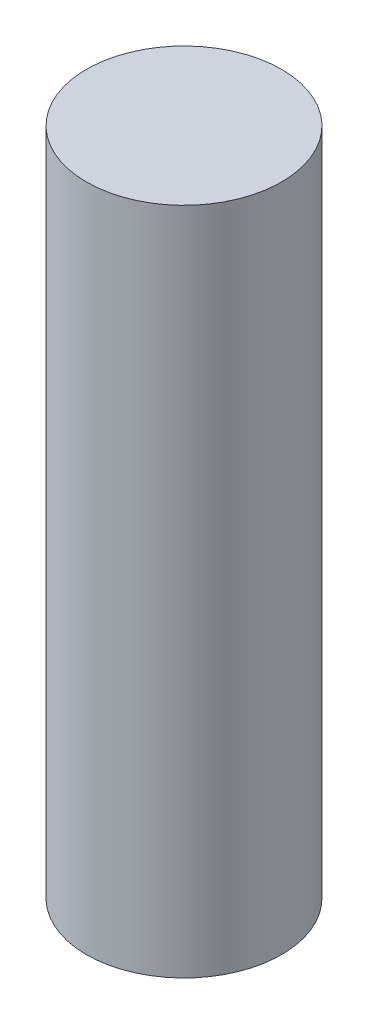
ISO-10303-21;
HEADER;
FILE_DESCRIPTION(('STEP AP214'),'2;1');
FILE_NAME('part.step','',(''),(''),'','','');
FILE_SCHEMA(('AUTOMOTIVE_DESIGN { 1 0 10303 214 1 1 1 1 }'));
ENDSEC;
DATA;
#1=APPLICATION_CONTEXT('core data for automotive mechanical design processes');
#2=APPLICATION_PROTOCOL_DEFINITION('international standard','automotive_design',2000,#1);
#3=PRODUCT_CONTEXT('',#1,'mechanical');
#4=PRODUCT('Part','Part','',(#3));
#5=PRODUCT_RELATED_PRODUCT_CATEGORY('part','',(#4));
#6=PRODUCT_DEFINITION_FORMATION('','',#4);
#7=PRODUCT_DEFINITION_CONTEXT('part definition',#1,'design');
#8=PRODUCT_DEFINITION('design','',#6,#7);
#9=PRODUCT_DEFINITION_SHAPE('','',#8);
#10=(LENGTH_UNIT() NAMED_UNIT(*) SI_UNIT(.MILLI.,.METRE.));
#11=(NAMED_UNIT(*) PLANE_ANGLE_UNIT() SI_UNIT($,.RADIAN.));
#12=(NAMED_UNIT(*) SI_UNIT($,.STERADIAN.) SOLID_ANGLE_UNIT());
#13=UNCERTAINTY_MEASURE_WITH_UNIT(LENGTH_MEASURE(1.E-05),#10,'distance_accuracy_value','');
#14=(GEOMETRIC_REPRESENTATION_CONTEXT(3) GLOBAL_UNCERTAINTY_ASSIGNED_CONTEXT((#13)) GLOBAL_UNIT_ASSIGNED_CONTEXT((#10,
#11,#12)) REPRESENTATION_CONTEXT('',''));
#15=CARTESIAN_POINT('',(0.,0.,0.));
#16=DIRECTION('',(0.,0.,1.));
#17=DIRECTION('',(1.,0.,0.));
#18=AXIS2_PLACEMENT_3D('',#15,#16,#17);
#19=CARTESIAN_POINT('',(0.,24.,0.));
#20=DIRECTION('',(0.,-1.,0.));
#21=DIRECTION('',(0.,0.,-1.));
#22=AXIS2_PLACEMENT_3D('',#19,#20,#21);
#23=CYLINDRICAL_SURFACE('',#22,3.5);
#24=CARTESIAN_POINT('',(0.,24.,0.));
#25=DIRECTION('',(0.,1.,0.));
#26=DIRECTION('',(0.,0.,1.));
#27=AXIS2_PLACEMENT_3D('',#24,#25,#26);
#28=CIRCLE('',#27,3.5);
#29=CARTESIAN_POINT('',(0.,24.,3.5));
#30=VERTEX_POINT('',#29);
#31=EDGE_CURVE('E10',#30,#30,#28,.T.);
#32=ORIENTED_EDGE('',*,*,#31,.F.);
#33=EDGE_LOOP('',(#32));
#34=FACE_BOUND('',#33,.T.);
#35=CARTESIAN_POINT('',(0.,0.,0.));
#36=DIRECTION('',(0.,1.,0.));
#37=DIRECTION('',(0.,0.,1.));
#38=AXIS2_PLACEMENT_3D('',#35,#36,#37);
#39=CIRCLE('',#38,3.5);
#40=CARTESIAN_POINT('',(0.,0.,3.5));
#41=VERTEX_POINT('',#40);
#42=EDGE_CURVE('E37',#41,#41,#39,.T.);
#43=ORIENTED_EDGE('',*,*,#42,.T.);
#44=EDGE_LOOP('',(#43));
#45=FACE_BOUND('',#44,.T.);
#46=ADVANCED_FACE('F34',(#34,#45),#23,.T.);
#47=CARTESIAN_POINT('',(0.,24.,0.));
#48=DIRECTION('',(0.,1.,0.));
#49=DIRECTION('',(0.,0.,1.));
#50=AXIS2_PLACEMENT_3D('',#47,#48,#49);
#51=PLANE('',#50);
#52=ORIENTED_EDGE('',*,*,#31,.T.);
#53=EDGE_LOOP('',(#52));
#54=FACE_BOUND('',#53,.T.);
#55=ADVANCED_FACE('F49',(#54),#51,.T.);
#56=CARTESIAN_POINT('',(0.,0.,0.));
#57=DIRECTION('',(0.,1.,0.));
#58=DIRECTION('',(0.,0.,1.));
#59=AXIS2_PLACEMENT_3D('',#56,#57,#58);
#60=PLANE('',#59);
#61=ORIENTED_EDGE('',*,*,#42,.F.);
#62=EDGE_LOOP('',(#61));
#63=FACE_BOUND('',#62,.T.);
#64=ADVANCED_FACE('F47',(#63),#60,.F.);
#65=CLOSED_SHELL('',(#46,#55,#64));
#66=MANIFOLD_SOLID_BREP('B2',#65);
#67=ADVANCED_BREP_SHAPE_REPRESENTATION('',(#18,#66),#14);
#68=SHAPE_DEFINITION_REPRESENTATION(#9,#67);
ENDSEC;
END-ISO-10303-21;
